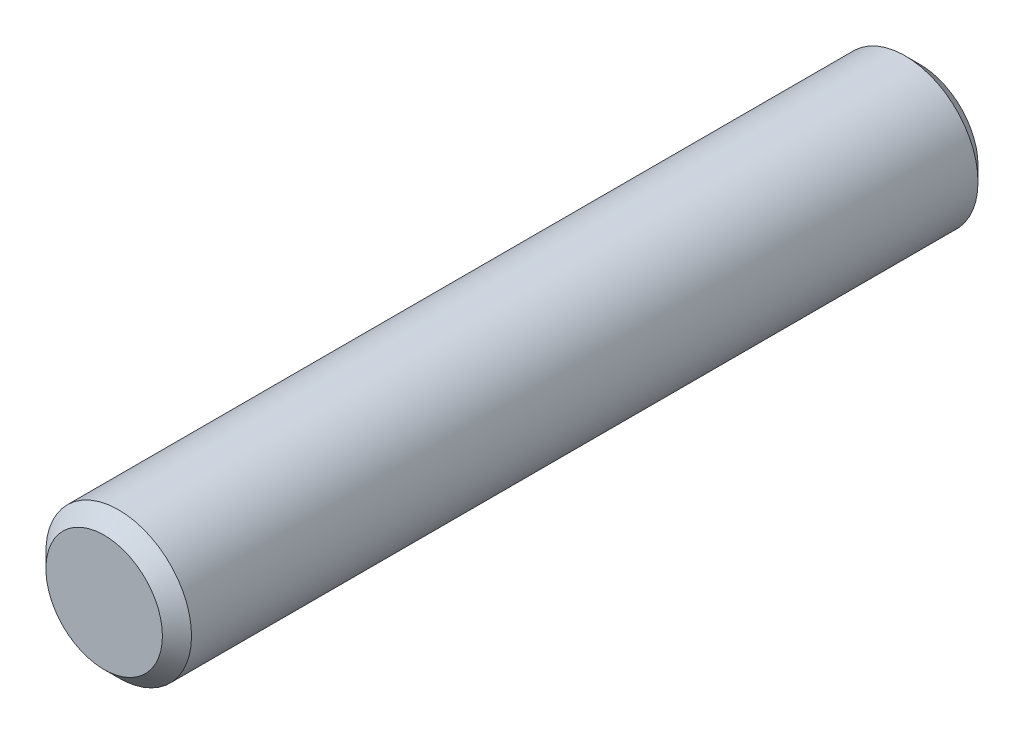
ISO-10303-21;
HEADER;
FILE_DESCRIPTION(('STEP AP214'),'2;1');
FILE_NAME('part.step','',(''),(''),'','','');
FILE_SCHEMA(('AUTOMOTIVE_DESIGN { 1 0 10303 214 1 1 1 1 }'));
ENDSEC;
DATA;
#1=APPLICATION_CONTEXT('core data for automotive mechanical design processes');
#2=APPLICATION_PROTOCOL_DEFINITION('international standard','automotive_design',2000,#1);
#3=PRODUCT_CONTEXT('',#1,'mechanical');
#4=PRODUCT('Part','Part','',(#3));
#5=PRODUCT_RELATED_PRODUCT_CATEGORY('part','',(#4));
#6=PRODUCT_DEFINITION_FORMATION('','',#4);
#7=PRODUCT_DEFINITION_CONTEXT('part definition',#1,'design');
#8=PRODUCT_DEFINITION('design','',#6,#7);
#9=PRODUCT_DEFINITION_SHAPE('','',#8);
#10=(LENGTH_UNIT() NAMED_UNIT(*) SI_UNIT(.MILLI.,.METRE.));
#11=(NAMED_UNIT(*) PLANE_ANGLE_UNIT() SI_UNIT($,.RADIAN.));
#12=(NAMED_UNIT(*) SI_UNIT($,.STERADIAN.) SOLID_ANGLE_UNIT());
#13=UNCERTAINTY_MEASURE_WITH_UNIT(LENGTH_MEASURE(1.E-05),#10,'distance_accuracy_value','');
#14=(GEOMETRIC_REPRESENTATION_CONTEXT(3) GLOBAL_UNCERTAINTY_ASSIGNED_CONTEXT((#13)) GLOBAL_UNIT_ASSIGNED_CONTEXT((#10,
#11,#12)) REPRESENTATION_CONTEXT('',''));
#15=CARTESIAN_POINT('',(0.,0.,0.));
#16=DIRECTION('',(0.,0.,1.));
#17=DIRECTION('',(1.,0.,0.));
#18=AXIS2_PLACEMENT_3D('',#15,#16,#17);
#19=CARTESIAN_POINT('',(0.,0.,-28.));
#20=DIRECTION('',(0.,0.,1.));
#21=DIRECTION('',(1.,0.,0.));
#22=AXIS2_PLACEMENT_3D('',#19,#20,#21);
#23=CYLINDRICAL_SURFACE('',#22,2.5);
#24=CARTESIAN_POINT('',(0.,0.,-27.5));
#25=DIRECTION('',(0.,0.,1.));
#26=DIRECTION('',(1.,0.,0.));
#27=AXIS2_PLACEMENT_3D('',#24,#25,#26);
#28=CIRCLE('',#27,2.5);
#29=CARTESIAN_POINT('',(2.5,0.,-27.5));
#30=VERTEX_POINT('',#29);
#31=EDGE_CURVE('E45',#30,#30,#28,.T.);
#32=ORIENTED_EDGE('',*,*,#31,.T.);
#33=EDGE_LOOP('',(#32));
#34=FACE_BOUND('',#33,.T.);
#35=CARTESIAN_POINT('',(0.,0.,-0.499999999999997));
#36=DIRECTION('',(0.,0.,1.));
#37=DIRECTION('',(1.,0.,0.));
#38=AXIS2_PLACEMENT_3D('',#35,#36,#37);
#39=CIRCLE('',#38,2.5);
#40=CARTESIAN_POINT('',(2.5,0.,-0.499999999999997));
#41=VERTEX_POINT('',#40);
#42=EDGE_CURVE('E49',#41,#41,#39,.F.);
#43=ORIENTED_EDGE('',*,*,#42,.T.);
#44=EDGE_LOOP('',(#43));
#45=FACE_BOUND('',#44,.T.);
#46=ADVANCED_FACE('F33',(#34,#45),#23,.T.);
#47=CARTESIAN_POINT('',(0.,0.,-28.));
#48=DIRECTION('',(0.,0.,1.));
#49=DIRECTION('',(1.,0.,0.));
#50=AXIS2_PLACEMENT_3D('',#47,#48,#49);
#51=PLANE('',#50);
#52=CARTESIAN_POINT('',(0.,0.,-28.));
#53=DIRECTION('',(0.,0.,1.));
#54=DIRECTION('',(1.,0.,0.));
#55=AXIS2_PLACEMENT_3D('',#52,#53,#54);
#56=CIRCLE('',#55,1.99999999999999);
#57=CARTESIAN_POINT('',(1.99999999999999,0.,-28.));
#58=VERTEX_POINT('',#57);
#59=EDGE_CURVE('E41',#58,#58,#56,.F.);
#60=ORIENTED_EDGE('',*,*,#59,.T.);
#61=EDGE_LOOP('',(#60));
#62=FACE_BOUND('',#61,.T.);
#63=ADVANCED_FACE('F65',(#62),#51,.F.);
#64=CARTESIAN_POINT('',(0.,0.,0.));
#65=DIRECTION('',(0.,0.,1.));
#66=DIRECTION('',(1.,0.,0.));
#67=AXIS2_PLACEMENT_3D('',#64,#65,#66);
#68=PLANE('',#67);
#69=CARTESIAN_POINT('',(0.,0.,0.));
#70=DIRECTION('',(0.,0.,1.));
#71=DIRECTION('',(1.,0.,0.));
#72=AXIS2_PLACEMENT_3D('',#69,#70,#71);
#73=CIRCLE('',#72,2.00000000000001);
#74=CARTESIAN_POINT('',(2.00000000000001,0.,0.));
#75=VERTEX_POINT('',#74);
#76=EDGE_CURVE('E10',#75,#75,#73,.T.);
#77=ORIENTED_EDGE('',*,*,#76,.T.);
#78=EDGE_LOOP('',(#77));
#79=FACE_BOUND('',#78,.T.);
#80=ADVANCED_FACE('F62',(#79),#68,.T.);
#81=CARTESIAN_POINT('',(0.,0.,-27.5));
#82=DIRECTION('',(0.,0.,1.));
#83=DIRECTION('',(1.,0.,0.));
#84=AXIS2_PLACEMENT_3D('',#81,#82,#83);
#85=CONICAL_SURFACE('',#84,2.5,0.785398163397453);
#86=ORIENTED_EDGE('',*,*,#59,.F.);
#87=EDGE_LOOP('',(#86));
#88=FACE_BOUND('',#87,.T.);
#89=ORIENTED_EDGE('',*,*,#31,.F.);
#90=EDGE_LOOP('',(#89));
#91=FACE_BOUND('',#90,.T.);
#92=ADVANCED_FACE('F58',(#88,#91),#85,.T.);
#93=CARTESIAN_POINT('',(0.,0.,0.));
#94=DIRECTION('',(0.,0.,-1.));
#95=DIRECTION('',(-1.,0.,0.));
#96=AXIS2_PLACEMENT_3D('',#93,#94,#95);
#97=CONICAL_SURFACE('',#96,2.00000000000001,0.785398163397446);
#98=ORIENTED_EDGE('',*,*,#42,.F.);
#99=EDGE_LOOP('',(#98));
#100=FACE_BOUND('',#99,.T.);
#101=ORIENTED_EDGE('',*,*,#76,.F.);
#102=EDGE_LOOP('',(#101));
#103=FACE_BOUND('',#102,.T.);
#104=ADVANCED_FACE('F36',(#100,#103),#97,.T.);
#105=CLOSED_SHELL('',(#46,#63,#80,#92,#104));
#106=MANIFOLD_SOLID_BREP('B2',#105);
#107=ADVANCED_BREP_SHAPE_REPRESENTATION('',(#18,#106),#14);
#108=SHAPE_DEFINITION_REPRESENTATION(#9,#107);
ENDSEC;
END-ISO-10303-21;
